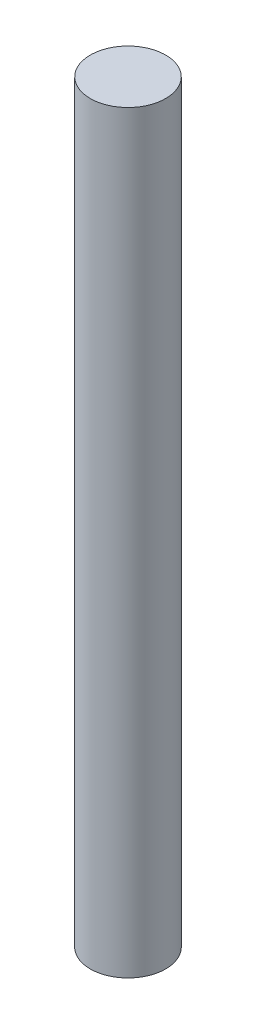
ISO-10303-21;
HEADER;
FILE_DESCRIPTION(('STEP AP214'),'2;1');
FILE_NAME('part.step','',(''),(''),'','','');
FILE_SCHEMA(('AUTOMOTIVE_DESIGN { 1 0 10303 214 1 1 1 1 }'));
ENDSEC;
DATA;
#1=APPLICATION_CONTEXT('core data for automotive mechanical design processes');
#2=APPLICATION_PROTOCOL_DEFINITION('international standard','automotive_design',2000,#1);
#3=PRODUCT_CONTEXT('',#1,'mechanical');
#4=PRODUCT('Part','Part','',(#3));
#5=PRODUCT_RELATED_PRODUCT_CATEGORY('part','',(#4));
#6=PRODUCT_DEFINITION_FORMATION('','',#4);
#7=PRODUCT_DEFINITION_CONTEXT('part definition',#1,'design');
#8=PRODUCT_DEFINITION('design','',#6,#7);
#9=PRODUCT_DEFINITION_SHAPE('','',#8);
#10=(LENGTH_UNIT() NAMED_UNIT(*) SI_UNIT(.MILLI.,.METRE.));
#11=(NAMED_UNIT(*) PLANE_ANGLE_UNIT() SI_UNIT($,.RADIAN.));
#12=(NAMED_UNIT(*) SI_UNIT($,.STERADIAN.) SOLID_ANGLE_UNIT());
#13=UNCERTAINTY_MEASURE_WITH_UNIT(LENGTH_MEASURE(1.E-05),#10,'distance_accuracy_value','');
#14=(GEOMETRIC_REPRESENTATION_CONTEXT(3) GLOBAL_UNCERTAINTY_ASSIGNED_CONTEXT((#13)) GLOBAL_UNIT_ASSIGNED_CONTEXT((#10,
#11,#12)) REPRESENTATION_CONTEXT('',''));
#15=CARTESIAN_POINT('',(0.,0.,0.));
#16=DIRECTION('',(0.,0.,1.));
#17=DIRECTION('',(1.,0.,0.));
#18=AXIS2_PLACEMENT_3D('',#15,#16,#17);
#19=CARTESIAN_POINT('',(0.,254.,0.));
#20=DIRECTION('',(0.,-1.,0.));
#21=DIRECTION('',(0.,0.,-1.));
#22=AXIS2_PLACEMENT_3D('',#19,#20,#21);
#23=CYLINDRICAL_SURFACE('',#22,12.7);
#24=CARTESIAN_POINT('',(0.,254.,0.));
#25=DIRECTION('',(0.,1.,0.));
#26=DIRECTION('',(0.,0.,1.));
#27=AXIS2_PLACEMENT_3D('',#24,#25,#26);
#28=CIRCLE('',#27,12.7);
#29=CARTESIAN_POINT('',(0.,254.,12.7));
#30=VERTEX_POINT('',#29);
#31=EDGE_CURVE('E10',#30,#30,#28,.T.);
#32=ORIENTED_EDGE('',*,*,#31,.F.);
#33=EDGE_LOOP('',(#32));
#34=FACE_BOUND('',#33,.T.);
#35=CARTESIAN_POINT('',(0.,0.,0.));
#36=DIRECTION('',(0.,1.,0.));
#37=DIRECTION('',(0.,0.,1.));
#38=AXIS2_PLACEMENT_3D('',#35,#36,#37);
#39=CIRCLE('',#38,12.7);
#40=CARTESIAN_POINT('',(0.,0.,12.7));
#41=VERTEX_POINT('',#40);
#42=EDGE_CURVE('E42',#41,#41,#39,.T.);
#43=ORIENTED_EDGE('',*,*,#42,.T.);
#44=EDGE_LOOP('',(#43));
#45=FACE_BOUND('',#44,.T.);
#46=ADVANCED_FACE('F39',(#34,#45),#23,.T.);
#47=CARTESIAN_POINT('',(0.,254.,0.));
#48=DIRECTION('',(0.,1.,0.));
#49=DIRECTION('',(0.,0.,1.));
#50=AXIS2_PLACEMENT_3D('',#47,#48,#49);
#51=PLANE('',#50);
#52=ORIENTED_EDGE('',*,*,#31,.T.);
#53=EDGE_LOOP('',(#52));
#54=FACE_BOUND('',#53,.T.);
#55=ADVANCED_FACE('F54',(#54),#51,.T.);
#56=CARTESIAN_POINT('',(0.,0.,0.));
#57=DIRECTION('',(0.,1.,0.));
#58=DIRECTION('',(0.,0.,1.));
#59=AXIS2_PLACEMENT_3D('',#56,#57,#58);
#60=PLANE('',#59);
#61=ORIENTED_EDGE('',*,*,#42,.F.);
#62=EDGE_LOOP('',(#61));
#63=FACE_BOUND('',#62,.T.);
#64=ADVANCED_FACE('F52',(#63),#60,.F.);
#65=CLOSED_SHELL('',(#46,#55,#64));
#66=MANIFOLD_SOLID_BREP('B2',#65);
#67=ADVANCED_BREP_SHAPE_REPRESENTATION('',(#18,#66),#14);
#68=SHAPE_DEFINITION_REPRESENTATION(#9,#67);
ENDSEC;
END-ISO-10303-21;
